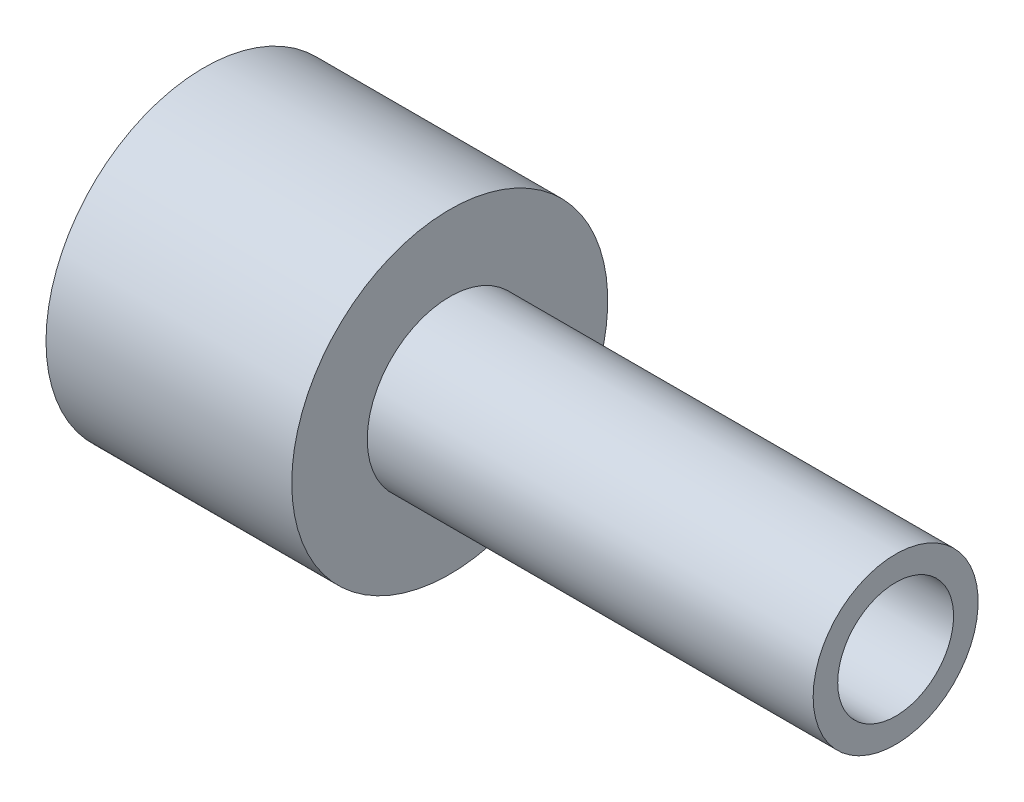
ISO-10303-21;
HEADER;
FILE_DESCRIPTION(('STEP AP214'),'2;1');
FILE_NAME('part.step','',(''),(''),'','','');
FILE_SCHEMA(('AUTOMOTIVE_DESIGN { 1 0 10303 214 1 1 1 1 }'));
ENDSEC;
DATA;
#1=APPLICATION_CONTEXT('core data for automotive mechanical design processes');
#2=APPLICATION_PROTOCOL_DEFINITION('international standard','automotive_design',2000,#1);
#3=PRODUCT_CONTEXT('',#1,'mechanical');
#4=PRODUCT('Part','Part','',(#3));
#5=PRODUCT_RELATED_PRODUCT_CATEGORY('part','',(#4));
#6=PRODUCT_DEFINITION_FORMATION('','',#4);
#7=PRODUCT_DEFINITION_CONTEXT('part definition',#1,'design');
#8=PRODUCT_DEFINITION('design','',#6,#7);
#9=PRODUCT_DEFINITION_SHAPE('','',#8);
#10=(LENGTH_UNIT() NAMED_UNIT(*) SI_UNIT(.MILLI.,.METRE.));
#11=(NAMED_UNIT(*) PLANE_ANGLE_UNIT() SI_UNIT($,.RADIAN.));
#12=(NAMED_UNIT(*) SI_UNIT($,.STERADIAN.) SOLID_ANGLE_UNIT());
#13=UNCERTAINTY_MEASURE_WITH_UNIT(LENGTH_MEASURE(1.E-05),#10,'distance_accuracy_value','');
#14=(GEOMETRIC_REPRESENTATION_CONTEXT(3) GLOBAL_UNCERTAINTY_ASSIGNED_CONTEXT((#13)) GLOBAL_UNIT_ASSIGNED_CONTEXT((#10,
#11,#12)) REPRESENTATION_CONTEXT('',''));
#15=CARTESIAN_POINT('',(0.,0.,0.));
#16=DIRECTION('',(0.,0.,1.));
#17=DIRECTION('',(1.,0.,0.));
#18=AXIS2_PLACEMENT_3D('',#15,#16,#17);
#19=CARTESIAN_POINT('',(-6.,4.5,0.));
#20=DIRECTION('',(1.,0.,0.));
#21=DIRECTION('',(0.,0.,-1.));
#22=AXIS2_PLACEMENT_3D('',#19,#20,#21);
#23=PLANE('',#22);
#24=CARTESIAN_POINT('',(-6.00000000000001,0.,0.));
#25=DIRECTION('',(-1.,0.,0.));
#26=DIRECTION('',(0.,0.,1.));
#27=AXIS2_PLACEMENT_3D('',#24,#25,#26);
#28=CIRCLE('',#27,1.65);
#29=CARTESIAN_POINT('',(-6.00000000000001,0.,1.65));
#30=VERTEX_POINT('',#29);
#31=EDGE_CURVE('E10',#30,#30,#28,.T.);
#32=ORIENTED_EDGE('',*,*,#31,.F.);
#33=EDGE_LOOP('',(#32));
#34=FACE_BOUND('',#33,.T.);
#35=CARTESIAN_POINT('',(-6.00000000000001,0.,0.));
#36=DIRECTION('',(-1.,0.,0.));
#37=DIRECTION('',(0.,0.,1.));
#38=AXIS2_PLACEMENT_3D('',#35,#36,#37);
#39=CIRCLE('',#38,4.5);
#40=CARTESIAN_POINT('',(-6.00000000000001,0.,4.5));
#41=VERTEX_POINT('',#40);
#42=EDGE_CURVE('E53',#41,#41,#39,.T.);
#43=ORIENTED_EDGE('',*,*,#42,.T.);
#44=EDGE_LOOP('',(#43));
#45=FACE_BOUND('',#44,.T.);
#46=ADVANCED_FACE('F31',(#34,#45),#23,.F.);
#47=CARTESIAN_POINT('',(-110.,0.,0.));
#48=DIRECTION('',(-1.,0.,0.));
#49=DIRECTION('',(0.,0.,1.));
#50=AXIS2_PLACEMENT_3D('',#47,#48,#49);
#51=CYLINDRICAL_SURFACE('',#50,1.65);
#52=CARTESIAN_POINT('',(13.7,0.,0.));
#53=DIRECTION('',(-1.,0.,0.));
#54=DIRECTION('',(0.,0.,1.));
#55=AXIS2_PLACEMENT_3D('',#52,#53,#54);
#56=CIRCLE('',#55,1.65);
#57=CARTESIAN_POINT('',(13.7,0.,1.65));
#58=VERTEX_POINT('',#57);
#59=EDGE_CURVE('E37',#58,#58,#56,.T.);
#60=ORIENTED_EDGE('',*,*,#59,.F.);
#61=EDGE_LOOP('',(#60));
#62=FACE_BOUND('',#61,.T.);
#63=ORIENTED_EDGE('',*,*,#31,.T.);
#64=EDGE_LOOP('',(#63));
#65=FACE_BOUND('',#64,.T.);
#66=ADVANCED_FACE('F78',(#62,#65),#51,.F.);
#67=CARTESIAN_POINT('',(13.7,1.65,0.));
#68=DIRECTION('',(-1.,0.,0.));
#69=DIRECTION('',(0.,0.,1.));
#70=AXIS2_PLACEMENT_3D('',#67,#68,#69);
#71=PLANE('',#70);
#72=CARTESIAN_POINT('',(13.7,0.,0.));
#73=DIRECTION('',(-1.,0.,0.));
#74=DIRECTION('',(0.,0.,1.));
#75=AXIS2_PLACEMENT_3D('',#72,#73,#74);
#76=CIRCLE('',#75,2.35);
#77=CARTESIAN_POINT('',(13.7,0.,2.35));
#78=VERTEX_POINT('',#77);
#79=EDGE_CURVE('E41',#78,#78,#76,.T.);
#80=ORIENTED_EDGE('',*,*,#79,.F.);
#81=EDGE_LOOP('',(#80));
#82=FACE_BOUND('',#81,.T.);
#83=ORIENTED_EDGE('',*,*,#59,.T.);
#84=EDGE_LOOP('',(#83));
#85=FACE_BOUND('',#84,.T.);
#86=ADVANCED_FACE('F73',(#82,#85),#71,.F.);
#87=CARTESIAN_POINT('',(-110.,0.,0.));
#88=DIRECTION('',(-1.,0.,0.));
#89=DIRECTION('',(0.,0.,1.));
#90=AXIS2_PLACEMENT_3D('',#87,#88,#89);
#91=CYLINDRICAL_SURFACE('',#90,2.35);
#92=CARTESIAN_POINT('',(1.,0.,0.));
#93=DIRECTION('',(-1.,0.,0.));
#94=DIRECTION('',(0.,0.,1.));
#95=AXIS2_PLACEMENT_3D('',#92,#93,#94);
#96=CIRCLE('',#95,2.35);
#97=CARTESIAN_POINT('',(1.,0.,2.35));
#98=VERTEX_POINT('',#97);
#99=EDGE_CURVE('E45',#98,#98,#96,.T.);
#100=ORIENTED_EDGE('',*,*,#99,.F.);
#101=EDGE_LOOP('',(#100));
#102=FACE_BOUND('',#101,.T.);
#103=ORIENTED_EDGE('',*,*,#79,.T.);
#104=EDGE_LOOP('',(#103));
#105=FACE_BOUND('',#104,.T.);
#106=ADVANCED_FACE('F67',(#102,#105),#91,.T.);
#107=CARTESIAN_POINT('',(1.,2.35,0.));
#108=DIRECTION('',(-1.,0.,0.));
#109=DIRECTION('',(0.,0.,1.));
#110=AXIS2_PLACEMENT_3D('',#107,#108,#109);
#111=PLANE('',#110);
#112=CARTESIAN_POINT('',(1.,0.,0.));
#113=DIRECTION('',(-1.,0.,0.));
#114=DIRECTION('',(0.,0.,1.));
#115=AXIS2_PLACEMENT_3D('',#112,#113,#114);
#116=CIRCLE('',#115,4.5);
#117=CARTESIAN_POINT('',(1.,0.,4.5));
#118=VERTEX_POINT('',#117);
#119=EDGE_CURVE('E50',#118,#118,#116,.T.);
#120=ORIENTED_EDGE('',*,*,#119,.F.);
#121=EDGE_LOOP('',(#120));
#122=FACE_BOUND('',#121,.T.);
#123=ORIENTED_EDGE('',*,*,#99,.T.);
#124=EDGE_LOOP('',(#123));
#125=FACE_BOUND('',#124,.T.);
#126=ADVANCED_FACE('F61',(#122,#125),#111,.F.);
#127=CARTESIAN_POINT('',(-110.,0.,0.));
#128=DIRECTION('',(-1.,0.,0.));
#129=DIRECTION('',(0.,0.,1.));
#130=AXIS2_PLACEMENT_3D('',#127,#128,#129);
#131=CYLINDRICAL_SURFACE('',#130,4.5);
#132=ORIENTED_EDGE('',*,*,#42,.F.);
#133=EDGE_LOOP('',(#132));
#134=FACE_BOUND('',#133,.T.);
#135=ORIENTED_EDGE('',*,*,#119,.T.);
#136=EDGE_LOOP('',(#135));
#137=FACE_BOUND('',#136,.T.);
#138=ADVANCED_FACE('F58',(#134,#137),#131,.T.);
#139=CLOSED_SHELL('',(#46,#66,#86,#106,#126,#138));
#140=MANIFOLD_SOLID_BREP('B2',#139);
#141=ADVANCED_BREP_SHAPE_REPRESENTATION('',(#18,#140),#14);
#142=SHAPE_DEFINITION_REPRESENTATION(#9,#141);
ENDSEC;
END-ISO-10303-21;
